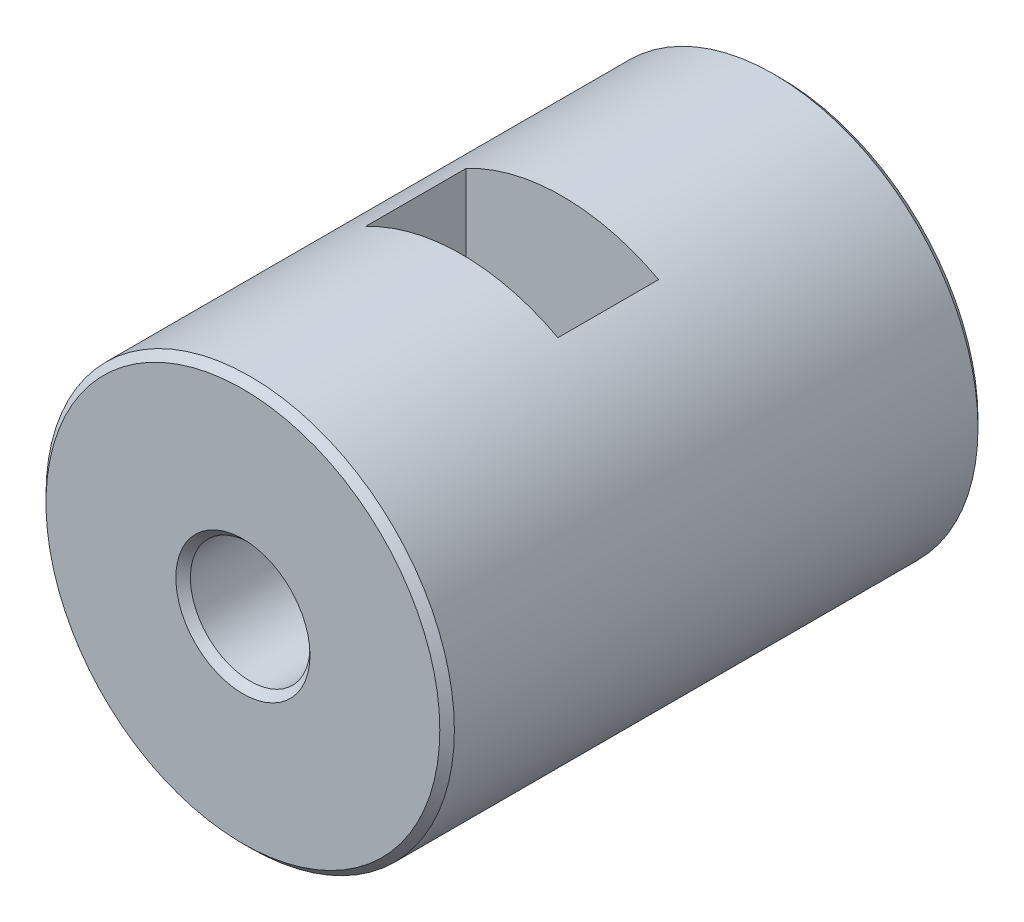
ISO-10303-21;
HEADER;
FILE_DESCRIPTION(('STEP AP214'),'2;1');
FILE_NAME('part.step','',(''),(''),'','','');
FILE_SCHEMA(('AUTOMOTIVE_DESIGN { 1 0 10303 214 1 1 1 1 }'));
ENDSEC;
DATA;
#1=APPLICATION_CONTEXT('core data for automotive mechanical design processes');
#2=APPLICATION_PROTOCOL_DEFINITION('international standard','automotive_design',2000,#1);
#3=PRODUCT_CONTEXT('',#1,'mechanical');
#4=PRODUCT('Part','Part','',(#3));
#5=PRODUCT_RELATED_PRODUCT_CATEGORY('part','',(#4));
#6=PRODUCT_DEFINITION_FORMATION('','',#4);
#7=PRODUCT_DEFINITION_CONTEXT('part definition',#1,'design');
#8=PRODUCT_DEFINITION('design','',#6,#7);
#9=PRODUCT_DEFINITION_SHAPE('','',#8);
#10=(LENGTH_UNIT() NAMED_UNIT(*) SI_UNIT(.MILLI.,.METRE.));
#11=(NAMED_UNIT(*) PLANE_ANGLE_UNIT() SI_UNIT($,.RADIAN.));
#12=(NAMED_UNIT(*) SI_UNIT($,.STERADIAN.) SOLID_ANGLE_UNIT());
#13=UNCERTAINTY_MEASURE_WITH_UNIT(LENGTH_MEASURE(1.E-05),#10,'distance_accuracy_value','');
#14=(GEOMETRIC_REPRESENTATION_CONTEXT(3) GLOBAL_UNCERTAINTY_ASSIGNED_CONTEXT((#13)) GLOBAL_UNIT_ASSIGNED_CONTEXT((#10,
#11,#12)) REPRESENTATION_CONTEXT('',''));
#15=CARTESIAN_POINT('',(0.,0.,0.));
#16=DIRECTION('',(0.,0.,1.));
#17=DIRECTION('',(1.,0.,0.));
#18=AXIS2_PLACEMENT_3D('',#15,#16,#17);
#19=CARTESIAN_POINT('',(0.,0.,15.));
#20=DIRECTION('',(0.,0.,-1.));
#21=DIRECTION('',(-1.,0.,0.));
#22=AXIS2_PLACEMENT_3D('',#19,#20,#21);
#23=CYLINDRICAL_SURFACE('',#22,14.);
#24=CARTESIAN_POINT('',(0.,0.,0.499999999999999));
#25=DIRECTION('',(0.,0.,1.));
#26=DIRECTION('',(1.,0.,0.));
#27=AXIS2_PLACEMENT_3D('',#24,#25,#26);
#28=CIRCLE('',#27,14.);
#29=CARTESIAN_POINT('',(14.,0.,0.499999999999999));
#30=VERTEX_POINT('',#29);
#31=EDGE_CURVE('E126',#30,#30,#28,.T.);
#32=ORIENTED_EDGE('',*,*,#31,.T.);
#33=EDGE_LOOP('',(#32));
#34=FACE_BOUND('',#33,.T.);
#35=CARTESIAN_POINT('',(0.,0.,36.4));
#36=DIRECTION('',(0.,0.,1.));
#37=DIRECTION('',(1.,0.,0.));
#38=AXIS2_PLACEMENT_3D('',#35,#36,#37);
#39=CIRCLE('',#38,14.);
#40=CARTESIAN_POINT('',(14.,0.,36.4));
#41=VERTEX_POINT('',#40);
#42=EDGE_CURVE('E123',#41,#41,#39,.F.);
#43=ORIENTED_EDGE('',*,*,#42,.T.);
#44=EDGE_LOOP('',(#43));
#45=FACE_BOUND('',#44,.T.);
#46=CARTESIAN_POINT('',(0.,0.,15.));
#47=DIRECTION('',(0.,0.,1.));
#48=DIRECTION('',(1.,0.,0.));
#49=AXIS2_PLACEMENT_3D('',#46,#47,#48);
#50=CIRCLE('',#49,14.);
#51=CARTESIAN_POINT('',(6.6,12.3466594672405,15.));
#52=VERTEX_POINT('',#51);
#53=CARTESIAN_POINT('',(-6.6,12.3466594672405,15.));
#54=VERTEX_POINT('',#53);
#55=EDGE_CURVE('E121',#52,#54,#50,.T.);
#56=ORIENTED_EDGE('',*,*,#55,.F.);
#57=DIRECTION('',(0.,0.,-1.));
#58=VECTOR('',#57,1.);
#59=CARTESIAN_POINT('',(6.6,12.3466594672405,21.9));
#60=LINE('',#59,#58);
#61=CARTESIAN_POINT('',(6.6,12.3466594672405,21.9));
#62=VERTEX_POINT('',#61);
#63=EDGE_CURVE('E117',#62,#52,#60,.T.);
#64=ORIENTED_EDGE('',*,*,#63,.F.);
#65=CARTESIAN_POINT('',(0.,0.,21.9));
#66=DIRECTION('',(0.,0.,1.));
#67=DIRECTION('',(1.,0.,0.));
#68=AXIS2_PLACEMENT_3D('',#65,#66,#67);
#69=CIRCLE('',#68,14.);
#70=CARTESIAN_POINT('',(-6.6,12.3466594672405,21.9));
#71=VERTEX_POINT('',#70);
#72=EDGE_CURVE('E107',#62,#71,#69,.T.);
#73=ORIENTED_EDGE('',*,*,#72,.T.);
#74=DIRECTION('',(0.,0.,-1.));
#75=VECTOR('',#74,1.);
#76=CARTESIAN_POINT('',(-6.6,12.3466594672405,21.9));
#77=LINE('',#76,#75);
#78=EDGE_CURVE('E82',#71,#54,#77,.T.);
#79=ORIENTED_EDGE('',*,*,#78,.T.);
#80=EDGE_LOOP('',(#56,#64,#73,#79));
#81=FACE_BOUND('',#80,.T.);
#82=ADVANCED_FACE('F32',(#34,#45,#81),#23,.T.);
#83=CARTESIAN_POINT('',(0.,0.,15.));
#84=DIRECTION('',(0.,0.,1.));
#85=DIRECTION('',(1.,0.,0.));
#86=AXIS2_PLACEMENT_3D('',#83,#84,#85);
#87=PLANE('',#86);
#88=CARTESIAN_POINT('',(0.,0.,15.));
#89=DIRECTION('',(0.,0.,1.));
#90=DIRECTION('',(1.,0.,0.));
#91=AXIS2_PLACEMENT_3D('',#88,#89,#90);
#92=CIRCLE('',#91,4.1);
#93=CARTESIAN_POINT('',(4.1,0.,15.));
#94=VERTEX_POINT('',#93);
#95=EDGE_CURVE('E221',#94,#94,#92,.T.);
#96=ORIENTED_EDGE('',*,*,#95,.F.);
#97=EDGE_LOOP('',(#96));
#98=FACE_BOUND('',#97,.T.);
#99=DIRECTION('',(0.,1.,0.));
#100=VECTOR('',#99,1.);
#101=CARTESIAN_POINT('',(-6.6,3.81051177665153,15.));
#102=LINE('',#101,#100);
#103=CARTESIAN_POINT('',(-6.6,-3.81051177665153,15.));
#104=VERTEX_POINT('',#103);
#105=EDGE_CURVE('E47',#104,#54,#102,.T.);
#106=ORIENTED_EDGE('',*,*,#105,.F.);
#107=DIRECTION('',(-0.866025403784438,0.5,0.));
#108=VECTOR('',#107,1.);
#109=CARTESIAN_POINT('',(-6.6,-3.81051177665153,15.));
#110=LINE('',#109,#108);
#111=CARTESIAN_POINT('',(0.,-7.62102355330306,15.));
#112=VERTEX_POINT('',#111);
#113=EDGE_CURVE('E51',#112,#104,#110,.T.);
#114=ORIENTED_EDGE('',*,*,#113,.F.);
#115=DIRECTION('',(-0.866025403784438,-0.5,0.));
#116=VECTOR('',#115,1.);
#117=CARTESIAN_POINT('',(0.,-7.62102355330306,15.));
#118=LINE('',#117,#116);
#119=CARTESIAN_POINT('',(6.6,-3.81051177665153,15.));
#120=VERTEX_POINT('',#119);
#121=EDGE_CURVE('E110',#120,#112,#118,.T.);
#122=ORIENTED_EDGE('',*,*,#121,.F.);
#123=DIRECTION('',(0.,-1.,0.));
#124=VECTOR('',#123,1.);
#125=CARTESIAN_POINT('',(6.6,-3.81051177665153,15.));
#126=LINE('',#125,#124);
#127=EDGE_CURVE('E106',#52,#120,#126,.T.);
#128=ORIENTED_EDGE('',*,*,#127,.F.);
#129=ORIENTED_EDGE('',*,*,#55,.T.);
#130=EDGE_LOOP('',(#106,#114,#122,#128,#129));
#131=FACE_BOUND('',#130,.T.);
#132=ADVANCED_FACE('F160',(#98,#131),#87,.T.);
#133=CARTESIAN_POINT('',(0.,0.,0.));
#134=DIRECTION('',(0.,0.,1.));
#135=DIRECTION('',(1.,0.,0.));
#136=AXIS2_PLACEMENT_3D('',#133,#134,#135);
#137=PLANE('',#136);
#138=CARTESIAN_POINT('',(0.,0.,0.));
#139=DIRECTION('',(0.,0.,1.));
#140=DIRECTION('',(1.,0.,0.));
#141=AXIS2_PLACEMENT_3D('',#138,#139,#140);
#142=CIRCLE('',#141,13.5);
#143=CARTESIAN_POINT('',(13.5,0.,0.));
#144=VERTEX_POINT('',#143);
#145=EDGE_CURVE('E132',#144,#144,#142,.F.);
#146=ORIENTED_EDGE('',*,*,#145,.T.);
#147=EDGE_LOOP('',(#146));
#148=FACE_BOUND('',#147,.T.);
#149=CARTESIAN_POINT('',(0.,0.,0.));
#150=DIRECTION('',(0.,0.,1.));
#151=DIRECTION('',(1.,0.,0.));
#152=AXIS2_PLACEMENT_3D('',#149,#150,#151);
#153=CIRCLE('',#152,4.6);
#154=CARTESIAN_POINT('',(4.6,0.,0.));
#155=VERTEX_POINT('',#154);
#156=EDGE_CURVE('E129',#155,#155,#153,.T.);
#157=ORIENTED_EDGE('',*,*,#156,.T.);
#158=EDGE_LOOP('',(#157));
#159=FACE_BOUND('',#158,.T.);
#160=ADVANCED_FACE('F166',(#148,#159),#137,.F.);
#161=CARTESIAN_POINT('',(-6.6,3.81051177665153,21.9));
#162=DIRECTION('',(-1.,0.,0.));
#163=DIRECTION('',(0.,-1.,0.));
#164=AXIS2_PLACEMENT_3D('',#161,#162,#163);
#165=PLANE('',#164);
#166=ORIENTED_EDGE('',*,*,#105,.T.);
#167=ORIENTED_EDGE('',*,*,#78,.F.);
#168=DIRECTION('',(0.,1.,0.));
#169=VECTOR('',#168,1.);
#170=CARTESIAN_POINT('',(-6.6,3.81051177665153,21.9));
#171=LINE('',#170,#169);
#172=CARTESIAN_POINT('',(-6.6,-3.81051177665153,21.9));
#173=VERTEX_POINT('',#172);
#174=EDGE_CURVE('E77',#173,#71,#171,.T.);
#175=ORIENTED_EDGE('',*,*,#174,.F.);
#176=DIRECTION('',(0.,0.,-1.));
#177=VECTOR('',#176,1.);
#178=CARTESIAN_POINT('',(-6.6,-3.81051177665153,21.9));
#179=LINE('',#178,#177);
#180=EDGE_CURVE('E80',#173,#104,#179,.T.);
#181=ORIENTED_EDGE('',*,*,#180,.T.);
#182=EDGE_LOOP('',(#166,#167,#175,#181));
#183=FACE_BOUND('',#182,.T.);
#184=ADVANCED_FACE('F79',(#183),#165,.F.);
#185=CARTESIAN_POINT('',(6.6,-3.81051177665153,21.9));
#186=DIRECTION('',(1.,0.,0.));
#187=DIRECTION('',(0.,1.,0.));
#188=AXIS2_PLACEMENT_3D('',#185,#186,#187);
#189=PLANE('',#188);
#190=ORIENTED_EDGE('',*,*,#127,.T.);
#191=DIRECTION('',(0.,0.,-1.));
#192=VECTOR('',#191,1.);
#193=CARTESIAN_POINT('',(6.6,-3.81051177665153,21.9));
#194=LINE('',#193,#192);
#195=CARTESIAN_POINT('',(6.6,-3.81051177665153,21.9));
#196=VERTEX_POINT('',#195);
#197=EDGE_CURVE('E114',#196,#120,#194,.T.);
#198=ORIENTED_EDGE('',*,*,#197,.F.);
#199=DIRECTION('',(0.,-1.,0.));
#200=VECTOR('',#199,1.);
#201=CARTESIAN_POINT('',(6.6,3.69504172281361,21.9));
#202=LINE('',#201,#200);
#203=EDGE_CURVE('E87',#62,#196,#202,.T.);
#204=ORIENTED_EDGE('',*,*,#203,.F.);
#205=ORIENTED_EDGE('',*,*,#63,.T.);
#206=EDGE_LOOP('',(#190,#198,#204,#205));
#207=FACE_BOUND('',#206,.T.);
#208=ADVANCED_FACE('F192',(#207),#189,.F.);
#209=CARTESIAN_POINT('',(0.,-7.62102355330306,21.9));
#210=DIRECTION('',(0.5,-0.866025403784438,0.));
#211=DIRECTION('',(0.866025403784439,0.5,0.));
#212=AXIS2_PLACEMENT_3D('',#209,#210,#211);
#213=PLANE('',#212);
#214=ORIENTED_EDGE('',*,*,#121,.T.);
#215=DIRECTION('',(0.,0.,-1.));
#216=VECTOR('',#215,1.);
#217=CARTESIAN_POINT('',(0.,-7.62102355330306,21.9));
#218=LINE('',#217,#216);
#219=CARTESIAN_POINT('',(0.,-7.62102355330306,21.9));
#220=VERTEX_POINT('',#219);
#221=EDGE_CURVE('E95',#220,#112,#218,.T.);
#222=ORIENTED_EDGE('',*,*,#221,.F.);
#223=DIRECTION('',(-0.866025403784438,-0.5,0.));
#224=VECTOR('',#223,1.);
#225=CARTESIAN_POINT('',(0.,-7.62102355330306,21.9));
#226=LINE('',#225,#224);
#227=EDGE_CURVE('E100',#196,#220,#226,.T.);
#228=ORIENTED_EDGE('',*,*,#227,.F.);
#229=ORIENTED_EDGE('',*,*,#197,.T.);
#230=EDGE_LOOP('',(#214,#222,#228,#229));
#231=FACE_BOUND('',#230,.T.);
#232=ADVANCED_FACE('F197',(#231),#213,.F.);
#233=CARTESIAN_POINT('',(-6.6,-3.81051177665153,21.9));
#234=DIRECTION('',(-0.5,-0.866025403784438,0.));
#235=DIRECTION('',(0.866025403784439,-0.5,0.));
#236=AXIS2_PLACEMENT_3D('',#233,#234,#235);
#237=PLANE('',#236);
#238=ORIENTED_EDGE('',*,*,#113,.T.);
#239=ORIENTED_EDGE('',*,*,#180,.F.);
#240=DIRECTION('',(-0.866025403784438,0.5,0.));
#241=VECTOR('',#240,1.);
#242=CARTESIAN_POINT('',(-6.6,-3.81051177665153,21.9));
#243=LINE('',#242,#241);
#244=EDGE_CURVE('E93',#220,#173,#243,.T.);
#245=ORIENTED_EDGE('',*,*,#244,.F.);
#246=ORIENTED_EDGE('',*,*,#221,.T.);
#247=EDGE_LOOP('',(#238,#239,#245,#246));
#248=FACE_BOUND('',#247,.T.);
#249=ADVANCED_FACE('F91',(#248),#237,.F.);
#250=CARTESIAN_POINT('',(0.,0.,21.9));
#251=DIRECTION('',(0.,0.,1.));
#252=DIRECTION('',(1.,0.,0.));
#253=AXIS2_PLACEMENT_3D('',#250,#251,#252);
#254=PLANE('',#253);
#255=CARTESIAN_POINT('',(0.,0.,21.9));
#256=DIRECTION('',(0.,0.,1.));
#257=DIRECTION('',(1.,0.,0.));
#258=AXIS2_PLACEMENT_3D('',#255,#256,#257);
#259=CIRCLE('',#258,4.1);
#260=CARTESIAN_POINT('',(4.1,0.,21.9));
#261=VERTEX_POINT('',#260);
#262=EDGE_CURVE('E220',#261,#261,#259,.T.);
#263=ORIENTED_EDGE('',*,*,#262,.T.);
#264=EDGE_LOOP('',(#263));
#265=FACE_BOUND('',#264,.T.);
#266=ORIENTED_EDGE('',*,*,#244,.T.);
#267=ORIENTED_EDGE('',*,*,#174,.T.);
#268=ORIENTED_EDGE('',*,*,#72,.F.);
#269=ORIENTED_EDGE('',*,*,#203,.T.);
#270=ORIENTED_EDGE('',*,*,#227,.T.);
#271=EDGE_LOOP('',(#266,#267,#268,#269,#270));
#272=FACE_BOUND('',#271,.T.);
#273=ADVANCED_FACE('F97',(#265,#272),#254,.F.);
#274=CARTESIAN_POINT('',(0.,0.,36.9));
#275=DIRECTION('',(0.,0.,1.));
#276=DIRECTION('',(1.,0.,0.));
#277=AXIS2_PLACEMENT_3D('',#274,#275,#276);
#278=PLANE('',#277);
#279=CARTESIAN_POINT('',(0.,0.,36.9));
#280=DIRECTION('',(0.,0.,1.));
#281=DIRECTION('',(1.,0.,0.));
#282=AXIS2_PLACEMENT_3D('',#279,#280,#281);
#283=CIRCLE('',#282,13.5);
#284=CARTESIAN_POINT('',(13.5,0.,36.9));
#285=VERTEX_POINT('',#284);
#286=EDGE_CURVE('E40',#285,#285,#283,.T.);
#287=ORIENTED_EDGE('',*,*,#286,.T.);
#288=EDGE_LOOP('',(#287));
#289=FACE_BOUND('',#288,.T.);
#290=CARTESIAN_POINT('',(0.,0.,36.9));
#291=DIRECTION('',(0.,0.,1.));
#292=DIRECTION('',(1.,0.,0.));
#293=AXIS2_PLACEMENT_3D('',#290,#291,#292);
#294=CIRCLE('',#293,4.6);
#295=CARTESIAN_POINT('',(4.6,0.,36.9));
#296=VERTEX_POINT('',#295);
#297=EDGE_CURVE('E138',#296,#296,#294,.F.);
#298=ORIENTED_EDGE('',*,*,#297,.T.);
#299=EDGE_LOOP('',(#298));
#300=FACE_BOUND('',#299,.T.);
#301=ADVANCED_FACE('F143',(#289,#300),#278,.T.);
#302=CARTESIAN_POINT('',(0.,0.,0.));
#303=DIRECTION('',(0.,0.,1.));
#304=DIRECTION('',(1.,0.,0.));
#305=AXIS2_PLACEMENT_3D('',#302,#303,#304);
#306=CYLINDRICAL_SURFACE('',#305,4.1);
#307=CARTESIAN_POINT('',(0.,0.,36.4));
#308=DIRECTION('',(0.,0.,1.));
#309=DIRECTION('',(1.,0.,0.));
#310=AXIS2_PLACEMENT_3D('',#307,#308,#309);
#311=CIRCLE('',#310,4.1);
#312=CARTESIAN_POINT('',(4.1,0.,36.4));
#313=VERTEX_POINT('',#312);
#314=EDGE_CURVE('E11',#313,#313,#311,.T.);
#315=ORIENTED_EDGE('',*,*,#314,.T.);
#316=EDGE_LOOP('',(#315));
#317=FACE_BOUND('',#316,.T.);
#318=ORIENTED_EDGE('',*,*,#262,.F.);
#319=EDGE_LOOP('',(#318));
#320=FACE_BOUND('',#319,.T.);
#321=ADVANCED_FACE('F178',(#317,#320),#306,.F.);
#322=CARTESIAN_POINT('',(0.,0.,0.5));
#323=DIRECTION('',(0.,0.,1.));
#324=DIRECTION('',(1.,0.,0.));
#325=AXIS2_PLACEMENT_3D('',#322,#323,#324);
#326=CIRCLE('',#325,4.1);
#327=CARTESIAN_POINT('',(4.1,0.,0.5));
#328=VERTEX_POINT('',#327);
#329=EDGE_CURVE('E135',#328,#328,#326,.F.);
#330=ORIENTED_EDGE('',*,*,#329,.T.);
#331=EDGE_LOOP('',(#330));
#332=FACE_BOUND('',#331,.T.);
#333=ORIENTED_EDGE('',*,*,#95,.T.);
#334=EDGE_LOOP('',(#333));
#335=FACE_BOUND('',#334,.T.);
#336=ADVANCED_FACE('F173',(#332,#335),#306,.F.);
#337=CARTESIAN_POINT('',(0.,0.,0.499999999999999));
#338=DIRECTION('',(0.,0.,1.));
#339=DIRECTION('',(1.,0.,0.));
#340=AXIS2_PLACEMENT_3D('',#337,#338,#339);
#341=CONICAL_SURFACE('',#340,14.,0.785398163397452);
#342=ORIENTED_EDGE('',*,*,#145,.F.);
#343=EDGE_LOOP('',(#342));
#344=FACE_BOUND('',#343,.T.);
#345=ORIENTED_EDGE('',*,*,#31,.F.);
#346=EDGE_LOOP('',(#345));
#347=FACE_BOUND('',#346,.T.);
#348=ADVANCED_FACE('F155',(#344,#347),#341,.T.);
#349=CARTESIAN_POINT('',(0.,0.,0.));
#350=DIRECTION('',(0.,0.,-1.));
#351=DIRECTION('',(-1.,0.,0.));
#352=AXIS2_PLACEMENT_3D('',#349,#350,#351);
#353=CONICAL_SURFACE('',#352,4.6,0.785398163397448);
#354=ORIENTED_EDGE('',*,*,#329,.F.);
#355=EDGE_LOOP('',(#354));
#356=FACE_BOUND('',#355,.T.);
#357=ORIENTED_EDGE('',*,*,#156,.F.);
#358=EDGE_LOOP('',(#357));
#359=FACE_BOUND('',#358,.T.);
#360=ADVANCED_FACE('F148',(#356,#359),#353,.F.);
#361=CARTESIAN_POINT('',(0.,0.,36.9));
#362=DIRECTION('',(0.,0.,-1.));
#363=DIRECTION('',(-1.,0.,0.));
#364=AXIS2_PLACEMENT_3D('',#361,#362,#363);
#365=CONICAL_SURFACE('',#364,13.5,0.785398163397443);
#366=ORIENTED_EDGE('',*,*,#42,.F.);
#367=EDGE_LOOP('',(#366));
#368=FACE_BOUND('',#367,.T.);
#369=ORIENTED_EDGE('',*,*,#286,.F.);
#370=EDGE_LOOP('',(#369));
#371=FACE_BOUND('',#370,.T.);
#372=ADVANCED_FACE('F146',(#368,#371),#365,.T.);
#373=CARTESIAN_POINT('',(0.,0.,36.4));
#374=DIRECTION('',(0.,0.,1.));
#375=DIRECTION('',(1.,0.,0.));
#376=AXIS2_PLACEMENT_3D('',#373,#374,#375);
#377=CONICAL_SURFACE('',#376,4.1,0.785398163397448);
#378=ORIENTED_EDGE('',*,*,#297,.F.);
#379=EDGE_LOOP('',(#378));
#380=FACE_BOUND('',#379,.T.);
#381=ORIENTED_EDGE('',*,*,#314,.F.);
#382=EDGE_LOOP('',(#381));
#383=FACE_BOUND('',#382,.T.);
#384=ADVANCED_FACE('F34',(#380,#383),#377,.F.);
#385=CLOSED_SHELL('',(#82,#132,#160,#184,#208,#232,#249,#273,#301,#321,#336,#348,#360,#372,#384));
#386=MANIFOLD_SOLID_BREP('B2',#385);
#387=ADVANCED_BREP_SHAPE_REPRESENTATION('',(#18,#386),#14);
#388=SHAPE_DEFINITION_REPRESENTATION(#9,#387);
ENDSEC;
END-ISO-10303-21;
